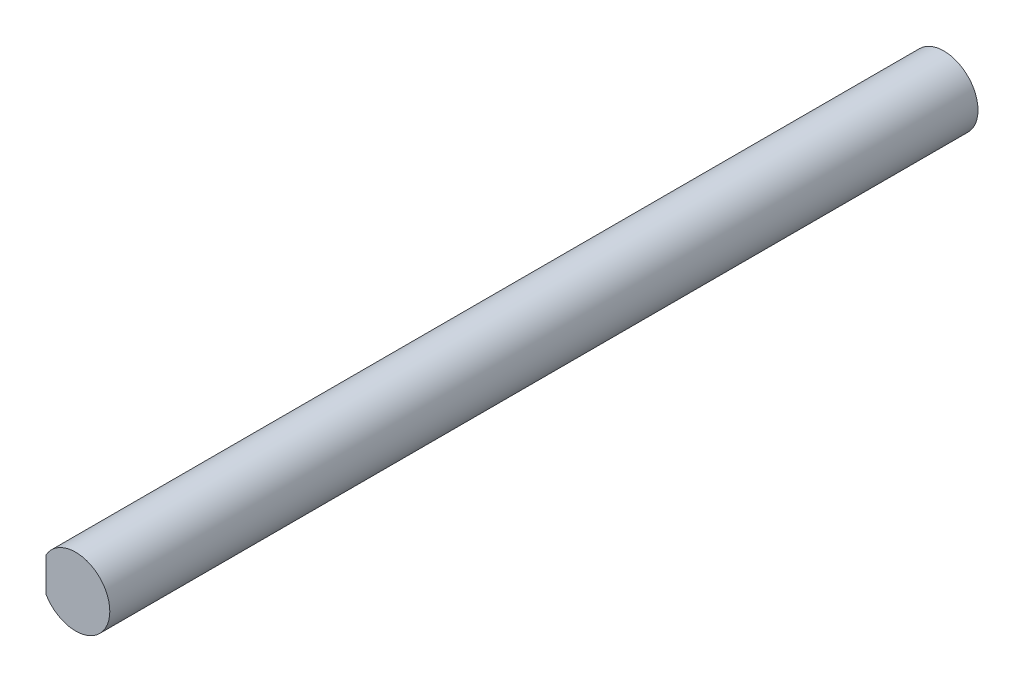
ISO-10303-21;
HEADER;
FILE_DESCRIPTION(('STEP AP214'),'2;1');
FILE_NAME('part.step','',(''),(''),'','','');
FILE_SCHEMA(('AUTOMOTIVE_DESIGN { 1 0 10303 214 1 1 1 1 }'));
ENDSEC;
DATA;
#1=APPLICATION_CONTEXT('core data for automotive mechanical design processes');
#2=APPLICATION_PROTOCOL_DEFINITION('international standard','automotive_design',2000,#1);
#3=PRODUCT_CONTEXT('',#1,'mechanical');
#4=PRODUCT('Part','Part','',(#3));
#5=PRODUCT_RELATED_PRODUCT_CATEGORY('part','',(#4));
#6=PRODUCT_DEFINITION_FORMATION('','',#4);
#7=PRODUCT_DEFINITION_CONTEXT('part definition',#1,'design');
#8=PRODUCT_DEFINITION('design','',#6,#7);
#9=PRODUCT_DEFINITION_SHAPE('','',#8);
#10=(LENGTH_UNIT() NAMED_UNIT(*) SI_UNIT(.MILLI.,.METRE.));
#11=(NAMED_UNIT(*) PLANE_ANGLE_UNIT() SI_UNIT($,.RADIAN.));
#12=(NAMED_UNIT(*) SI_UNIT($,.STERADIAN.) SOLID_ANGLE_UNIT());
#13=UNCERTAINTY_MEASURE_WITH_UNIT(LENGTH_MEASURE(1.E-05),#10,'distance_accuracy_value','');
#14=(GEOMETRIC_REPRESENTATION_CONTEXT(3) GLOBAL_UNCERTAINTY_ASSIGNED_CONTEXT((#13)) GLOBAL_UNIT_ASSIGNED_CONTEXT((#10,
#11,#12)) REPRESENTATION_CONTEXT('',''));
#15=CARTESIAN_POINT('',(0.,0.,0.));
#16=DIRECTION('',(0.,0.,1.));
#17=DIRECTION('',(1.,0.,0.));
#18=AXIS2_PLACEMENT_3D('',#15,#16,#17);
#19=CARTESIAN_POINT('',(0.,0.,76.2));
#20=DIRECTION('',(0.,0.,-1.));
#21=DIRECTION('',(-1.,0.,0.));
#22=AXIS2_PLACEMENT_3D('',#19,#20,#21);
#23=CYLINDRICAL_SURFACE('',#22,3.);
#24=CARTESIAN_POINT('',(0.,0.,0.));
#25=DIRECTION('',(0.,0.,1.));
#26=DIRECTION('',(1.,0.,0.));
#27=AXIS2_PLACEMENT_3D('',#24,#25,#26);
#28=CIRCLE('',#27,3.);
#29=CARTESIAN_POINT('',(-2.599999976,-1.49666299640233,0.));
#30=VERTEX_POINT('',#29);
#31=CARTESIAN_POINT('',(-2.599999976,1.49666299640233,0.));
#32=VERTEX_POINT('',#31);
#33=EDGE_CURVE('E69',#30,#32,#28,.T.);
#34=ORIENTED_EDGE('',*,*,#33,.T.);
#35=DIRECTION('',(0.,0.,-1.));
#36=VECTOR('',#35,1.);
#37=CARTESIAN_POINT('',(-2.599999976,1.49666299640233,76.2));
#38=LINE('',#37,#36);
#39=CARTESIAN_POINT('',(-2.599999976,1.49666299640233,76.2));
#40=VERTEX_POINT('',#39);
#41=EDGE_CURVE('E49',#40,#32,#38,.T.);
#42=ORIENTED_EDGE('',*,*,#41,.F.);
#43=CARTESIAN_POINT('',(0.,0.,76.2));
#44=DIRECTION('',(0.,0.,1.));
#45=DIRECTION('',(1.,0.,0.));
#46=AXIS2_PLACEMENT_3D('',#43,#44,#45);
#47=CIRCLE('',#46,3.);
#48=CARTESIAN_POINT('',(-2.599999976,-1.49666299640233,76.2));
#49=VERTEX_POINT('',#48);
#50=EDGE_CURVE('E73',#49,#40,#47,.T.);
#51=ORIENTED_EDGE('',*,*,#50,.F.);
#52=DIRECTION('',(0.,0.,-1.));
#53=VECTOR('',#52,1.);
#54=CARTESIAN_POINT('',(-2.599999976,-1.49666299640233,76.2));
#55=LINE('',#54,#53);
#56=EDGE_CURVE('E11',#49,#30,#55,.T.);
#57=ORIENTED_EDGE('',*,*,#56,.T.);
#58=EDGE_LOOP('',(#34,#42,#51,#57));
#59=FACE_BOUND('',#58,.T.);
#60=ADVANCED_FACE('F41',(#59),#23,.T.);
#61=CARTESIAN_POINT('',(-2.599999976,0.,76.2));
#62=DIRECTION('',(1.,0.,0.));
#63=DIRECTION('',(0.,0.,-1.));
#64=AXIS2_PLACEMENT_3D('',#61,#62,#63);
#65=PLANE('',#64);
#66=DIRECTION('',(0.,-1.,0.));
#67=VECTOR('',#66,1.);
#68=CARTESIAN_POINT('',(-2.599999976,0.,0.));
#69=LINE('',#68,#67);
#70=EDGE_CURVE('E64',#32,#30,#69,.T.);
#71=ORIENTED_EDGE('',*,*,#70,.T.);
#72=ORIENTED_EDGE('',*,*,#56,.F.);
#73=DIRECTION('',(0.,-1.,0.));
#74=VECTOR('',#73,1.);
#75=CARTESIAN_POINT('',(-2.599999976,0.,76.2));
#76=LINE('',#75,#74);
#77=EDGE_CURVE('E57',#40,#49,#76,.T.);
#78=ORIENTED_EDGE('',*,*,#77,.F.);
#79=ORIENTED_EDGE('',*,*,#41,.T.);
#80=EDGE_LOOP('',(#71,#72,#78,#79));
#81=FACE_BOUND('',#80,.T.);
#82=ADVANCED_FACE('F72',(#81),#65,.F.);
#83=CARTESIAN_POINT('',(0.,0.,76.2));
#84=DIRECTION('',(0.,0.,1.));
#85=DIRECTION('',(1.,0.,0.));
#86=AXIS2_PLACEMENT_3D('',#83,#84,#85);
#87=PLANE('',#86);
#88=ORIENTED_EDGE('',*,*,#77,.T.);
#89=ORIENTED_EDGE('',*,*,#50,.T.);
#90=EDGE_LOOP('',(#88,#89));
#91=FACE_BOUND('',#90,.T.);
#92=ADVANCED_FACE('F79',(#91),#87,.T.);
#93=CARTESIAN_POINT('',(0.,0.,0.));
#94=DIRECTION('',(0.,0.,1.));
#95=DIRECTION('',(1.,0.,0.));
#96=AXIS2_PLACEMENT_3D('',#93,#94,#95);
#97=PLANE('',#96);
#98=ORIENTED_EDGE('',*,*,#33,.F.);
#99=ORIENTED_EDGE('',*,*,#70,.F.);
#100=EDGE_LOOP('',(#98,#99));
#101=FACE_BOUND('',#100,.T.);
#102=ADVANCED_FACE('F74',(#101),#97,.F.);
#103=CLOSED_SHELL('',(#60,#82,#92,#102));
#104=MANIFOLD_SOLID_BREP('B2',#103);
#105=ADVANCED_BREP_SHAPE_REPRESENTATION('',(#18,#104),#14);
#106=SHAPE_DEFINITION_REPRESENTATION(#9,#105);
ENDSEC;
END-ISO-10303-21;
